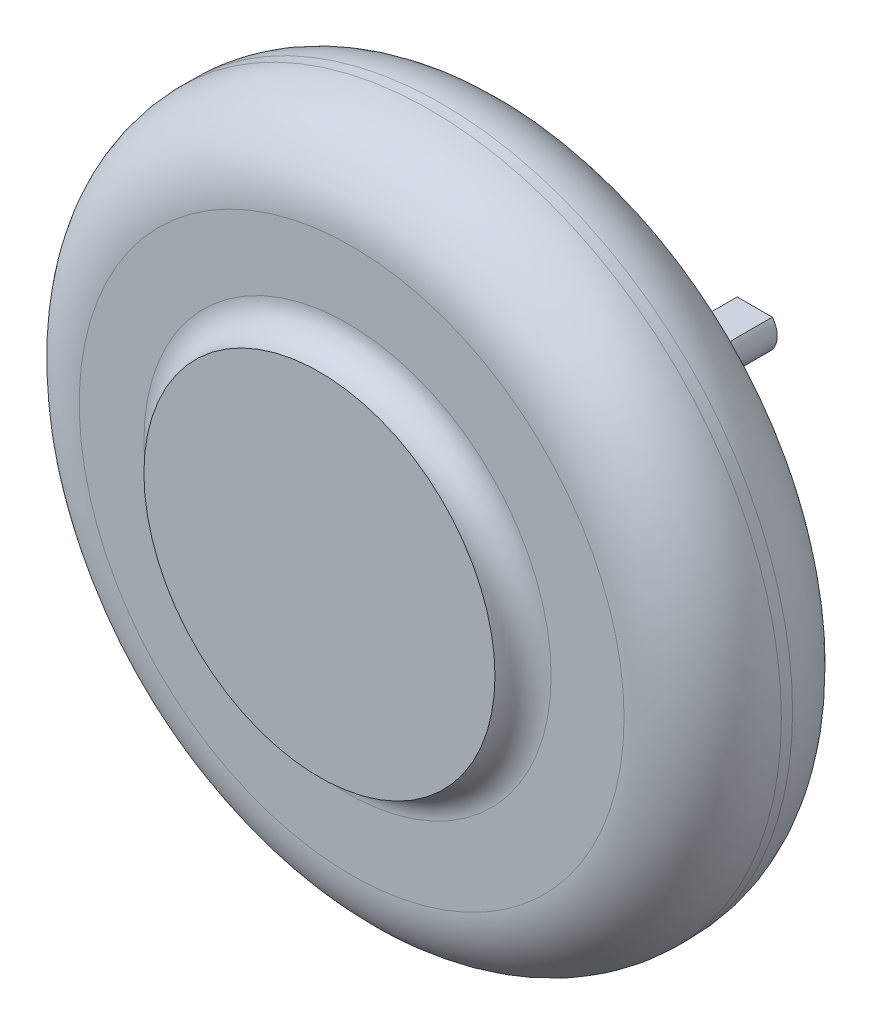
ISO-10303-21;
HEADER;
FILE_DESCRIPTION(('STEP AP214'),'2;1');
FILE_NAME('part.step','',(''),(''),'','','');
FILE_SCHEMA(('AUTOMOTIVE_DESIGN { 1 0 10303 214 1 1 1 1 }'));
ENDSEC;
DATA;
#1=APPLICATION_CONTEXT('core data for automotive mechanical design processes');
#2=APPLICATION_PROTOCOL_DEFINITION('international standard','automotive_design',2000,#1);
#3=PRODUCT_CONTEXT('',#1,'mechanical');
#4=PRODUCT('Part','Part','',(#3));
#5=PRODUCT_RELATED_PRODUCT_CATEGORY('part','',(#4));
#6=PRODUCT_DEFINITION_FORMATION('','',#4);
#7=PRODUCT_DEFINITION_CONTEXT('part definition',#1,'design');
#8=PRODUCT_DEFINITION('design','',#6,#7);
#9=PRODUCT_DEFINITION_SHAPE('','',#8);
#10=(LENGTH_UNIT() NAMED_UNIT(*) SI_UNIT(.MILLI.,.METRE.));
#11=(NAMED_UNIT(*) PLANE_ANGLE_UNIT() SI_UNIT($,.RADIAN.));
#12=(NAMED_UNIT(*) SI_UNIT($,.STERADIAN.) SOLID_ANGLE_UNIT());
#13=UNCERTAINTY_MEASURE_WITH_UNIT(LENGTH_MEASURE(1.E-05),#10,'distance_accuracy_value','');
#14=(GEOMETRIC_REPRESENTATION_CONTEXT(3) GLOBAL_UNCERTAINTY_ASSIGNED_CONTEXT((#13)) GLOBAL_UNIT_ASSIGNED_CONTEXT((#10,
#11,#12)) REPRESENTATION_CONTEXT('',''));
#15=CARTESIAN_POINT('',(0.,0.,0.));
#16=DIRECTION('',(0.,0.,1.));
#17=DIRECTION('',(1.,0.,0.));
#18=AXIS2_PLACEMENT_3D('',#15,#16,#17);
#19=CARTESIAN_POINT('',(1.46312569317631,0.,60.));
#20=DIRECTION('',(0.,0.,-1.));
#21=DIRECTION('',(-1.,0.,0.));
#22=AXIS2_PLACEMENT_3D('',#19,#20,#21);
#23=CYLINDRICAL_SURFACE('',#22,125.);
#24=CARTESIAN_POINT('',(1.46312569317631,0.,28.));
#25=DIRECTION('',(0.,0.,1.));
#26=DIRECTION('',(1.,0.,0.));
#27=AXIS2_PLACEMENT_3D('',#24,#25,#26);
#28=CIRCLE('',#27,125.);
#29=CARTESIAN_POINT('',(126.463125693176,0.,28.));
#30=VERTEX_POINT('',#29);
#31=EDGE_CURVE('E120',#30,#30,#28,.T.);
#32=ORIENTED_EDGE('',*,*,#31,.T.);
#33=EDGE_LOOP('',(#32));
#34=FACE_BOUND('',#33,.T.);
#35=CARTESIAN_POINT('',(1.46312569317631,0.,32.));
#36=DIRECTION('',(0.,0.,1.));
#37=DIRECTION('',(1.,0.,0.));
#38=AXIS2_PLACEMENT_3D('',#35,#36,#37);
#39=CIRCLE('',#38,125.);
#40=CARTESIAN_POINT('',(126.463125693176,0.,32.));
#41=VERTEX_POINT('',#40);
#42=EDGE_CURVE('E116',#41,#41,#39,.F.);
#43=ORIENTED_EDGE('',*,*,#42,.T.);
#44=EDGE_LOOP('',(#43));
#45=FACE_BOUND('',#44,.T.);
#46=ADVANCED_FACE('F38',(#34,#45),#23,.T.);
#47=CARTESIAN_POINT('',(1.46312569317631,0.,60.));
#48=DIRECTION('',(0.,0.,1.));
#49=DIRECTION('',(1.,0.,0.));
#50=AXIS2_PLACEMENT_3D('',#47,#48,#49);
#51=PLANE('',#50);
#52=CARTESIAN_POINT('',(1.46312569317631,0.,60.));
#53=DIRECTION('',(0.,0.,1.));
#54=DIRECTION('',(1.,0.,0.));
#55=AXIS2_PLACEMENT_3D('',#52,#53,#54);
#56=CIRCLE('',#55,97.);
#57=CARTESIAN_POINT('',(98.4631256931763,0.,60.));
#58=VERTEX_POINT('',#57);
#59=EDGE_CURVE('E11',#58,#58,#56,.T.);
#60=ORIENTED_EDGE('',*,*,#59,.T.);
#61=EDGE_LOOP('',(#60));
#62=FACE_BOUND('',#61,.T.);
#63=CARTESIAN_POINT('',(0.,0.,60.));
#64=DIRECTION('',(0.,0.,1.));
#65=DIRECTION('',(1.,0.,0.));
#66=AXIS2_PLACEMENT_3D('',#63,#64,#65);
#67=CIRCLE('',#66,72.5);
#68=CARTESIAN_POINT('',(72.5,0.,60.));
#69=VERTEX_POINT('',#68);
#70=EDGE_CURVE('E112',#69,#69,#67,.F.);
#71=ORIENTED_EDGE('',*,*,#70,.T.);
#72=EDGE_LOOP('',(#71));
#73=FACE_BOUND('',#72,.T.);
#74=ADVANCED_FACE('F138',(#62,#73),#51,.T.);
#75=CARTESIAN_POINT('',(1.46312569317631,0.,0.));
#76=DIRECTION('',(0.,0.,1.));
#77=DIRECTION('',(1.,0.,0.));
#78=AXIS2_PLACEMENT_3D('',#75,#76,#77);
#79=PLANE('',#78);
#80=CARTESIAN_POINT('',(1.46312569317631,0.,0.));
#81=DIRECTION('',(0.,0.,1.));
#82=DIRECTION('',(1.,0.,0.));
#83=AXIS2_PLACEMENT_3D('',#80,#81,#82);
#84=CIRCLE('',#83,97.);
#85=CARTESIAN_POINT('',(98.4631256931763,0.,0.));
#86=VERTEX_POINT('',#85);
#87=EDGE_CURVE('E47',#86,#86,#84,.F.);
#88=ORIENTED_EDGE('',*,*,#87,.T.);
#89=EDGE_LOOP('',(#88));
#90=FACE_BOUND('',#89,.T.);
#91=CARTESIAN_POINT('',(0.,0.,0.));
#92=DIRECTION('',(0.,0.,1.));
#93=DIRECTION('',(1.,0.,0.));
#94=AXIS2_PLACEMENT_3D('',#91,#92,#93);
#95=CIRCLE('',#94,32.5);
#96=CARTESIAN_POINT('',(32.5,0.,0.));
#97=VERTEX_POINT('',#96);
#98=EDGE_CURVE('E108',#97,#97,#95,.T.);
#99=ORIENTED_EDGE('',*,*,#98,.T.);
#100=EDGE_LOOP('',(#99));
#101=FACE_BOUND('',#100,.T.);
#102=ADVANCED_FACE('F127',(#90,#101),#79,.F.);
#103=CARTESIAN_POINT('',(0.,0.,70.));
#104=DIRECTION('',(0.,0.,1.));
#105=DIRECTION('',(1.,0.,0.));
#106=AXIS2_PLACEMENT_3D('',#103,#104,#105);
#107=PLANE('',#106);
#108=CARTESIAN_POINT('',(0.,0.,70.));
#109=DIRECTION('',(0.,0.,1.));
#110=DIRECTION('',(1.,0.,0.));
#111=AXIS2_PLACEMENT_3D('',#108,#109,#110);
#112=CIRCLE('',#111,62.5);
#113=CARTESIAN_POINT('',(62.5,0.,70.));
#114=VERTEX_POINT('',#113);
#115=EDGE_CURVE('E98',#114,#114,#112,.T.);
#116=ORIENTED_EDGE('',*,*,#115,.T.);
#117=EDGE_LOOP('',(#116));
#118=FACE_BOUND('',#117,.T.);
#119=ADVANCED_FACE('F157',(#118),#107,.T.);
#120=CARTESIAN_POINT('',(0.,0.,-15.));
#121=DIRECTION('',(0.,0.,1.));
#122=DIRECTION('',(1.,0.,0.));
#123=AXIS2_PLACEMENT_3D('',#120,#121,#122);
#124=CYLINDRICAL_SURFACE('',#123,22.5);
#125=CARTESIAN_POINT('',(0.,0.,-10.));
#126=DIRECTION('',(0.,0.,1.));
#127=DIRECTION('',(1.,0.,0.));
#128=AXIS2_PLACEMENT_3D('',#125,#126,#127);
#129=CIRCLE('',#128,22.5);
#130=CARTESIAN_POINT('',(22.5,0.,-10.));
#131=VERTEX_POINT('',#130);
#132=EDGE_CURVE('E97',#131,#131,#129,.F.);
#133=ORIENTED_EDGE('',*,*,#132,.T.);
#134=EDGE_LOOP('',(#133));
#135=FACE_BOUND('',#134,.T.);
#136=CARTESIAN_POINT('',(0.,0.,-15.));
#137=DIRECTION('',(0.,0.,-1.));
#138=DIRECTION('',(-1.,0.,0.));
#139=AXIS2_PLACEMENT_3D('',#136,#137,#138);
#140=CIRCLE('',#139,22.5);
#141=CARTESIAN_POINT('',(-22.5,0.,-15.));
#142=VERTEX_POINT('',#141);
#143=EDGE_CURVE('E92',#142,#142,#140,.T.);
#144=ORIENTED_EDGE('',*,*,#143,.F.);
#145=EDGE_LOOP('',(#144));
#146=FACE_BOUND('',#145,.T.);
#147=ADVANCED_FACE('F159',(#135,#146),#124,.T.);
#148=CARTESIAN_POINT('',(0.,0.,-15.));
#149=DIRECTION('',(0.,0.,-1.));
#150=DIRECTION('',(-1.,0.,0.));
#151=AXIS2_PLACEMENT_3D('',#148,#149,#150);
#152=PLANE('',#151);
#153=CARTESIAN_POINT('',(0.,0.,-15.));
#154=DIRECTION('',(0.,0.,-1.));
#155=DIRECTION('',(-1.,0.,0.));
#156=AXIS2_PLACEMENT_3D('',#153,#154,#155);
#157=CIRCLE('',#156,8.);
#158=CARTESIAN_POINT('',(-8.,0.,-15.));
#159=VERTEX_POINT('',#158);
#160=EDGE_CURVE('E93',#159,#159,#157,.T.);
#161=ORIENTED_EDGE('',*,*,#160,.F.);
#162=EDGE_LOOP('',(#161));
#163=FACE_BOUND('',#162,.T.);
#164=ORIENTED_EDGE('',*,*,#143,.T.);
#165=EDGE_LOOP('',(#164));
#166=FACE_BOUND('',#165,.T.);
#167=ADVANCED_FACE('F165',(#163,#166),#152,.T.);
#168=CARTESIAN_POINT('',(0.,0.,-85.));
#169=DIRECTION('',(0.,0.,1.));
#170=DIRECTION('',(1.,0.,0.));
#171=AXIS2_PLACEMENT_3D('',#168,#169,#170);
#172=CYLINDRICAL_SURFACE('',#171,8.);
#173=CARTESIAN_POINT('',(0.,0.,-85.));
#174=DIRECTION('',(0.,0.,-1.));
#175=DIRECTION('',(-1.,0.,0.));
#176=AXIS2_PLACEMENT_3D('',#173,#174,#175);
#177=CIRCLE('',#176,8.);
#178=CARTESIAN_POINT('',(6.2449979983984,5.,-85.));
#179=VERTEX_POINT('',#178);
#180=CARTESIAN_POINT('',(-6.2449979983984,5.,-85.));
#181=VERTEX_POINT('',#180);
#182=EDGE_CURVE('E70',#179,#181,#177,.T.);
#183=ORIENTED_EDGE('',*,*,#182,.F.);
#184=DIRECTION('',(0.,0.,1.));
#185=VECTOR('',#184,1.);
#186=CARTESIAN_POINT('',(6.2449979983984,5.,-708.79695367394));
#187=LINE('',#186,#185);
#188=CARTESIAN_POINT('',(6.2449979983984,5.,-40.));
#189=VERTEX_POINT('',#188);
#190=EDGE_CURVE('E67',#179,#189,#187,.T.);
#191=ORIENTED_EDGE('',*,*,#190,.T.);
#192=CARTESIAN_POINT('',(0.,0.,-40.));
#193=DIRECTION('',(0.,0.,-1.));
#194=DIRECTION('',(-1.,0.,0.));
#195=AXIS2_PLACEMENT_3D('',#192,#193,#194);
#196=CIRCLE('',#195,8.);
#197=CARTESIAN_POINT('',(-6.2449979983984,5.,-40.));
#198=VERTEX_POINT('',#197);
#199=EDGE_CURVE('E54',#198,#189,#196,.T.);
#200=ORIENTED_EDGE('',*,*,#199,.F.);
#201=DIRECTION('',(0.,0.,1.));
#202=VECTOR('',#201,1.);
#203=CARTESIAN_POINT('',(-6.2449979983984,5.,-708.79695367394));
#204=LINE('',#203,#202);
#205=EDGE_CURVE('E74',#181,#198,#204,.T.);
#206=ORIENTED_EDGE('',*,*,#205,.F.);
#207=EDGE_LOOP('',(#183,#191,#200,#206));
#208=FACE_BOUND('',#207,.T.);
#209=ORIENTED_EDGE('',*,*,#160,.T.);
#210=EDGE_LOOP('',(#209));
#211=FACE_BOUND('',#210,.T.);
#212=ADVANCED_FACE('F68',(#208,#211),#172,.T.);
#213=CARTESIAN_POINT('',(0.,0.,-85.));
#214=DIRECTION('',(0.,0.,-1.));
#215=DIRECTION('',(-1.,0.,0.));
#216=AXIS2_PLACEMENT_3D('',#213,#214,#215);
#217=PLANE('',#216);
#218=DIRECTION('',(-1.,0.,0.));
#219=VECTOR('',#218,1.);
#220=CARTESIAN_POINT('',(6.2449979983984,5.,-85.));
#221=LINE('',#220,#219);
#222=EDGE_CURVE('E61',#179,#181,#221,.T.);
#223=ORIENTED_EDGE('',*,*,#222,.F.);
#224=ORIENTED_EDGE('',*,*,#182,.T.);
#225=EDGE_LOOP('',(#223,#224));
#226=FACE_BOUND('',#225,.T.);
#227=ADVANCED_FACE('F172',(#226),#217,.T.);
#228=CARTESIAN_POINT('',(0.,0.,-10.));
#229=DIRECTION('',(0.,0.,1.));
#230=DIRECTION('',(1.,0.,0.));
#231=AXIS2_PLACEMENT_3D('',#228,#229,#230);
#232=TOROIDAL_SURFACE('',#231,32.5,10.);
#233=ORIENTED_EDGE('',*,*,#98,.F.);
#234=EDGE_LOOP('',(#233));
#235=FACE_BOUND('',#234,.T.);
#236=ORIENTED_EDGE('',*,*,#132,.F.);
#237=EDGE_LOOP('',(#236));
#238=FACE_BOUND('',#237,.T.);
#239=ADVANCED_FACE('F153',(#235,#238),#232,.F.);
#240=CARTESIAN_POINT('',(0.,0.,70.));
#241=DIRECTION('',(0.,0.,1.));
#242=DIRECTION('',(1.,0.,0.));
#243=AXIS2_PLACEMENT_3D('',#240,#241,#242);
#244=TOROIDAL_SURFACE('',#243,72.5,10.);
#245=ORIENTED_EDGE('',*,*,#70,.F.);
#246=EDGE_LOOP('',(#245));
#247=FACE_BOUND('',#246,.T.);
#248=ORIENTED_EDGE('',*,*,#115,.F.);
#249=EDGE_LOOP('',(#248));
#250=FACE_BOUND('',#249,.T.);
#251=ADVANCED_FACE('F133',(#247,#250),#244,.F.);
#252=CARTESIAN_POINT('',(1.46312569317631,0.,28.));
#253=DIRECTION('',(0.,0.,1.));
#254=DIRECTION('',(1.,0.,0.));
#255=AXIS2_PLACEMENT_3D('',#252,#253,#254);
#256=TOROIDAL_SURFACE('',#255,97.,28.);
#257=ORIENTED_EDGE('',*,*,#87,.F.);
#258=EDGE_LOOP('',(#257));
#259=FACE_BOUND('',#258,.T.);
#260=ORIENTED_EDGE('',*,*,#31,.F.);
#261=EDGE_LOOP('',(#260));
#262=FACE_BOUND('',#261,.T.);
#263=ADVANCED_FACE('F130',(#259,#262),#256,.T.);
#264=CARTESIAN_POINT('',(1.46312569317631,0.,32.));
#265=DIRECTION('',(0.,0.,1.));
#266=DIRECTION('',(1.,0.,0.));
#267=AXIS2_PLACEMENT_3D('',#264,#265,#266);
#268=TOROIDAL_SURFACE('',#267,97.,28.);
#269=ORIENTED_EDGE('',*,*,#42,.F.);
#270=EDGE_LOOP('',(#269));
#271=FACE_BOUND('',#270,.T.);
#272=ORIENTED_EDGE('',*,*,#59,.F.);
#273=EDGE_LOOP('',(#272));
#274=FACE_BOUND('',#273,.T.);
#275=ADVANCED_FACE('F40',(#271,#274),#268,.T.);
#276=CARTESIAN_POINT('',(6.2449979983984,5.,-708.79695367394));
#277=DIRECTION('',(0.,1.,0.));
#278=DIRECTION('',(0.,0.,1.));
#279=AXIS2_PLACEMENT_3D('',#276,#277,#278);
#280=PLANE('',#279);
#281=ORIENTED_EDGE('',*,*,#190,.F.);
#282=ORIENTED_EDGE('',*,*,#222,.T.);
#283=ORIENTED_EDGE('',*,*,#205,.T.);
#284=DIRECTION('',(-1.,0.,0.));
#285=VECTOR('',#284,1.);
#286=CARTESIAN_POINT('',(6.2449979983984,5.,-40.));
#287=LINE('',#286,#285);
#288=EDGE_CURVE('E78',#189,#198,#287,.T.);
#289=ORIENTED_EDGE('',*,*,#288,.F.);
#290=EDGE_LOOP('',(#281,#282,#283,#289));
#291=FACE_BOUND('',#290,.T.);
#292=ADVANCED_FACE('F82',(#291),#280,.T.);
#293=CARTESIAN_POINT('',(0.,0.,-40.));
#294=DIRECTION('',(0.,0.,-1.));
#295=DIRECTION('',(-1.,0.,0.));
#296=AXIS2_PLACEMENT_3D('',#293,#294,#295);
#297=PLANE('',#296);
#298=ORIENTED_EDGE('',*,*,#288,.T.);
#299=ORIENTED_EDGE('',*,*,#199,.T.);
#300=EDGE_LOOP('',(#298,#299));
#301=FACE_BOUND('',#300,.T.);
#302=ADVANCED_FACE('F77',(#301),#297,.T.);
#303=CLOSED_SHELL('',(#46,#74,#102,#119,#147,#167,#212,#227,#239,#251,#263,#275,#292,#302));
#304=MANIFOLD_SOLID_BREP('B2',#303);
#305=ADVANCED_BREP_SHAPE_REPRESENTATION('',(#18,#304),#14);
#306=SHAPE_DEFINITION_REPRESENTATION(#9,#305);
ENDSEC;
END-ISO-10303-21;
